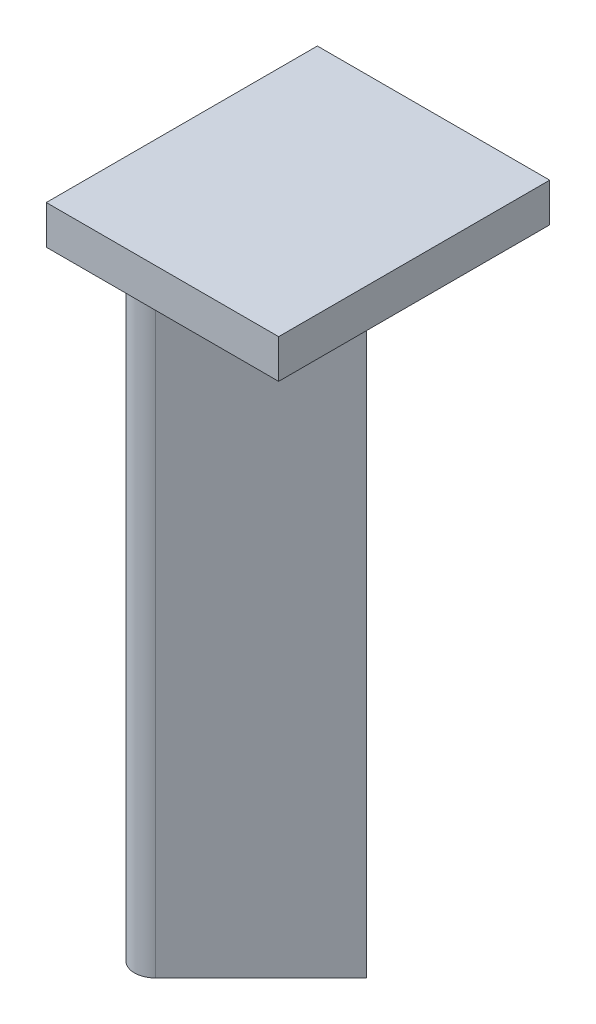
ISO-10303-21;
HEADER;
FILE_DESCRIPTION(('STEP AP214'),'2;1');
FILE_NAME('part.step','',(''),(''),'','','');
FILE_SCHEMA(('AUTOMOTIVE_DESIGN { 1 0 10303 214 1 1 1 1 }'));
ENDSEC;
DATA;
#1=APPLICATION_CONTEXT('core data for automotive mechanical design processes');
#2=APPLICATION_PROTOCOL_DEFINITION('international standard','automotive_design',2000,#1);
#3=PRODUCT_CONTEXT('',#1,'mechanical');
#4=PRODUCT('Part','Part','',(#3));
#5=PRODUCT_RELATED_PRODUCT_CATEGORY('part','',(#4));
#6=PRODUCT_DEFINITION_FORMATION('','',#4);
#7=PRODUCT_DEFINITION_CONTEXT('part definition',#1,'design');
#8=PRODUCT_DEFINITION('design','',#6,#7);
#9=PRODUCT_DEFINITION_SHAPE('','',#8);
#10=(LENGTH_UNIT() NAMED_UNIT(*) SI_UNIT(.MILLI.,.METRE.));
#11=(NAMED_UNIT(*) PLANE_ANGLE_UNIT() SI_UNIT($,.RADIAN.));
#12=(NAMED_UNIT(*) SI_UNIT($,.STERADIAN.) SOLID_ANGLE_UNIT());
#13=UNCERTAINTY_MEASURE_WITH_UNIT(LENGTH_MEASURE(1.E-05),#10,'distance_accuracy_value','');
#14=(GEOMETRIC_REPRESENTATION_CONTEXT(3) GLOBAL_UNCERTAINTY_ASSIGNED_CONTEXT((#13)) GLOBAL_UNIT_ASSIGNED_CONTEXT((#10,
#11,#12)) REPRESENTATION_CONTEXT('',''));
#15=CARTESIAN_POINT('',(0.,0.,0.));
#16=DIRECTION('',(0.,0.,1.));
#17=DIRECTION('',(1.,0.,0.));
#18=AXIS2_PLACEMENT_3D('',#15,#16,#17);
#19=CARTESIAN_POINT('',(0.,78.,0.));
#20=DIRECTION('',(0.,-1.,0.));
#21=DIRECTION('',(0.,0.,-1.));
#22=AXIS2_PLACEMENT_3D('',#19,#20,#21);
#23=CYLINDRICAL_SURFACE('',#22,1.02);
#24=CARTESIAN_POINT('',(0.,0.,0.));
#25=DIRECTION('',(0.,-1.,0.));
#26=DIRECTION('',(0.,0.,1.));
#27=AXIS2_PLACEMENT_3D('',#24,#25,#26);
#28=CIRCLE('',#27,1.02);
#29=CARTESIAN_POINT('',(-0.706968119469067,0.,-0.735252390716529));
#30=VERTEX_POINT('',#29);
#31=CARTESIAN_POINT('',(-0.706968119469067,0.,0.735252390716529));
#32=VERTEX_POINT('',#31);
#33=EDGE_CURVE('E135',#30,#32,#28,.T.);
#34=ORIENTED_EDGE('',*,*,#33,.T.);
#35=DIRECTION('',(0.,-1.,0.));
#36=VECTOR('',#35,1.);
#37=CARTESIAN_POINT('',(-0.706968119469067,78.,0.735252390716529));
#38=LINE('',#37,#36);
#39=CARTESIAN_POINT('',(-0.706968119469067,78.,0.735252390716529));
#40=VERTEX_POINT('',#39);
#41=EDGE_CURVE('E11',#40,#32,#38,.T.);
#42=ORIENTED_EDGE('',*,*,#41,.F.);
#43=CARTESIAN_POINT('',(0.,78.,0.));
#44=DIRECTION('',(0.,-1.,0.));
#45=DIRECTION('',(0.,0.,1.));
#46=AXIS2_PLACEMENT_3D('',#43,#44,#45);
#47=CIRCLE('',#46,1.02);
#48=CARTESIAN_POINT('',(-0.706968119469067,78.,-0.735252390716529));
#49=VERTEX_POINT('',#48);
#50=EDGE_CURVE('E148',#49,#40,#47,.T.);
#51=ORIENTED_EDGE('',*,*,#50,.F.);
#52=DIRECTION('',(0.,-1.,0.));
#53=VECTOR('',#52,1.);
#54=CARTESIAN_POINT('',(-0.706968119469067,78.,-0.735252390716529));
#55=LINE('',#54,#53);
#56=EDGE_CURVE('E134',#49,#30,#55,.T.);
#57=ORIENTED_EDGE('',*,*,#56,.T.);
#58=EDGE_LOOP('',(#34,#42,#51,#57));
#59=FACE_BOUND('',#58,.T.);
#60=ADVANCED_FACE('F34',(#59),#23,.F.);
#61=CARTESIAN_POINT('',(-0.706968119469067,78.,0.735252390716529));
#62=DIRECTION('',(0.707106781186548,0.,0.707106781186547));
#63=DIRECTION('',(0.707106781186547,0.,-0.707106781186548));
#64=AXIS2_PLACEMENT_3D('',#61,#62,#63);
#65=PLANE('',#64);
#66=DIRECTION('',(-0.707106781186547,0.,0.707106781186548));
#67=VECTOR('',#66,1.);
#68=CARTESIAN_POINT('',(-0.706968119469067,0.,0.735252390716529));
#69=LINE('',#68,#67);
#70=CARTESIAN_POINT('',(-9.81464212286927,0.,9.84292639411675));
#71=VERTEX_POINT('',#70);
#72=EDGE_CURVE('E138',#32,#71,#69,.T.);
#73=ORIENTED_EDGE('',*,*,#72,.T.);
#74=DIRECTION('',(0.,-1.,0.));
#75=VECTOR('',#74,1.);
#76=CARTESIAN_POINT('',(-9.81464212286927,78.,9.84292639411675));
#77=LINE('',#76,#75);
#78=CARTESIAN_POINT('',(-9.81464212286927,78.,9.84292639411675));
#79=VERTEX_POINT('',#78);
#80=EDGE_CURVE('E42',#79,#71,#77,.T.);
#81=ORIENTED_EDGE('',*,*,#80,.F.);
#82=DIRECTION('',(-0.707106781186547,0.,0.707106781186548));
#83=VECTOR('',#82,1.);
#84=CARTESIAN_POINT('',(-0.706968119469067,78.,0.735252390716529));
#85=LINE('',#84,#83);
#86=EDGE_CURVE('E89',#40,#79,#85,.T.);
#87=ORIENTED_EDGE('',*,*,#86,.F.);
#88=ORIENTED_EDGE('',*,*,#41,.T.);
#89=EDGE_LOOP('',(#73,#81,#87,#88));
#90=FACE_BOUND('',#89,.T.);
#91=ADVANCED_FACE('F240',(#90),#65,.F.);
#92=CARTESIAN_POINT('',(-7.91959594928933,78.,11.7379725676967));
#93=DIRECTION('',(0.,-1.,0.));
#94=DIRECTION('',(0.,0.,-1.));
#95=AXIS2_PLACEMENT_3D('',#92,#93,#94);
#96=CYLINDRICAL_SURFACE('',#95,2.68);
#97=CARTESIAN_POINT('',(-7.91959594928933,0.,11.7379725676967));
#98=DIRECTION('',(0.,1.,0.));
#99=DIRECTION('',(0.,0.,-1.));
#100=AXIS2_PLACEMENT_3D('',#97,#98,#99);
#101=CIRCLE('',#100,2.68);
#102=CARTESIAN_POINT('',(-6.02454977570939,0.,13.6330187412766));
#103=VERTEX_POINT('',#102);
#104=EDGE_CURVE('E141',#71,#103,#101,.T.);
#105=ORIENTED_EDGE('',*,*,#104,.T.);
#106=DIRECTION('',(0.,-1.,0.));
#107=VECTOR('',#106,1.);
#108=CARTESIAN_POINT('',(-6.02454977570939,78.,13.6330187412766));
#109=LINE('',#108,#107);
#110=CARTESIAN_POINT('',(-6.02454977570939,78.,13.6330187412766));
#111=VERTEX_POINT('',#110);
#112=EDGE_CURVE('E112',#111,#103,#109,.T.);
#113=ORIENTED_EDGE('',*,*,#112,.F.);
#114=CARTESIAN_POINT('',(-7.91959594928933,78.,11.7379725676967));
#115=DIRECTION('',(0.,1.,0.));
#116=DIRECTION('',(0.,0.,-1.));
#117=AXIS2_PLACEMENT_3D('',#114,#115,#116);
#118=CIRCLE('',#117,2.68);
#119=EDGE_CURVE('E126',#79,#111,#118,.T.);
#120=ORIENTED_EDGE('',*,*,#119,.F.);
#121=ORIENTED_EDGE('',*,*,#80,.T.);
#122=EDGE_LOOP('',(#105,#113,#120,#121));
#123=FACE_BOUND('',#122,.T.);
#124=ADVANCED_FACE('F155',(#123),#96,.T.);
#125=CARTESIAN_POINT('',(7.60846896556725,78.,0.));
#126=DIRECTION('',(-0.707106781186548,0.,-0.707106781186548));
#127=DIRECTION('',(-0.707106781186548,0.,0.707106781186548));
#128=AXIS2_PLACEMENT_3D('',#125,#126,#127);
#129=PLANE('',#128);
#130=DIRECTION('',(0.707106781186548,0.,-0.707106781186548));
#131=VECTOR('',#130,1.);
#132=CARTESIAN_POINT('',(7.60846896556725,0.,0.));
#133=LINE('',#132,#131);
#134=CARTESIAN_POINT('',(7.60846896556725,0.,0.));
#135=VERTEX_POINT('',#134);
#136=EDGE_CURVE('E109',#103,#135,#133,.T.);
#137=ORIENTED_EDGE('',*,*,#136,.T.);
#138=DIRECTION('',(0.,-1.,0.));
#139=VECTOR('',#138,1.);
#140=CARTESIAN_POINT('',(7.60846896556725,78.,0.));
#141=LINE('',#140,#139);
#142=CARTESIAN_POINT('',(7.60846896556725,78.,0.));
#143=VERTEX_POINT('',#142);
#144=EDGE_CURVE('E101',#143,#135,#141,.T.);
#145=ORIENTED_EDGE('',*,*,#144,.F.);
#146=DIRECTION('',(0.707106781186548,0.,-0.707106781186548));
#147=VECTOR('',#146,1.);
#148=CARTESIAN_POINT('',(7.60846896556725,78.,0.));
#149=LINE('',#148,#147);
#150=EDGE_CURVE('E106',#111,#143,#149,.T.);
#151=ORIENTED_EDGE('',*,*,#150,.F.);
#152=ORIENTED_EDGE('',*,*,#112,.T.);
#153=EDGE_LOOP('',(#137,#145,#151,#152));
#154=FACE_BOUND('',#153,.T.);
#155=ADVANCED_FACE('F103',(#154),#129,.F.);
#156=CARTESIAN_POINT('',(7.60846896556725,78.,0.));
#157=DIRECTION('',(-0.707106781186548,0.,0.707106781186547));
#158=DIRECTION('',(0.707106781186547,0.,0.707106781186548));
#159=AXIS2_PLACEMENT_3D('',#156,#157,#158);
#160=PLANE('',#159);
#161=DIRECTION('',(-0.707106781186547,0.,-0.707106781186548));
#162=VECTOR('',#161,1.);
#163=CARTESIAN_POINT('',(7.60846896556725,0.,0.));
#164=LINE('',#163,#162);
#165=CARTESIAN_POINT('',(-6.02454977570938,0.,-13.6330187412766));
#166=VERTEX_POINT('',#165);
#167=EDGE_CURVE('E144',#135,#166,#164,.T.);
#168=ORIENTED_EDGE('',*,*,#167,.T.);
#169=DIRECTION('',(0.,-1.,0.));
#170=VECTOR('',#169,1.);
#171=CARTESIAN_POINT('',(-6.02454977570938,78.,-13.6330187412766));
#172=LINE('',#171,#170);
#173=CARTESIAN_POINT('',(-6.02454977570938,78.,-13.6330187412766));
#174=VERTEX_POINT('',#173);
#175=EDGE_CURVE('E113',#174,#166,#172,.T.);
#176=ORIENTED_EDGE('',*,*,#175,.F.);
#177=DIRECTION('',(-0.707106781186547,0.,-0.707106781186548));
#178=VECTOR('',#177,1.);
#179=CARTESIAN_POINT('',(7.60846896556725,78.,0.));
#180=LINE('',#179,#178);
#181=EDGE_CURVE('E116',#143,#174,#180,.T.);
#182=ORIENTED_EDGE('',*,*,#181,.F.);
#183=ORIENTED_EDGE('',*,*,#144,.T.);
#184=EDGE_LOOP('',(#168,#176,#182,#183));
#185=FACE_BOUND('',#184,.T.);
#186=ADVANCED_FACE('F117',(#185),#160,.F.);
#187=CARTESIAN_POINT('',(-7.91959594928933,78.,-11.7379725676967));
#188=DIRECTION('',(0.,-1.,0.));
#189=DIRECTION('',(0.,0.,-1.));
#190=AXIS2_PLACEMENT_3D('',#187,#188,#189);
#191=CYLINDRICAL_SURFACE('',#190,2.68);
#192=CARTESIAN_POINT('',(-7.91959594928933,0.,-11.7379725676967));
#193=DIRECTION('',(0.,1.,0.));
#194=DIRECTION('',(0.,0.,-1.));
#195=AXIS2_PLACEMENT_3D('',#192,#193,#194);
#196=CIRCLE('',#195,2.68);
#197=CARTESIAN_POINT('',(-9.81464212286928,0.,-9.84292639411674));
#198=VERTEX_POINT('',#197);
#199=EDGE_CURVE('E75',#166,#198,#196,.T.);
#200=ORIENTED_EDGE('',*,*,#199,.T.);
#201=DIRECTION('',(0.,-1.,0.));
#202=VECTOR('',#201,1.);
#203=CARTESIAN_POINT('',(-9.81464212286928,78.,-9.84292639411674));
#204=LINE('',#203,#202);
#205=CARTESIAN_POINT('',(-9.81464212286928,78.,-9.84292639411674));
#206=VERTEX_POINT('',#205);
#207=EDGE_CURVE('E50',#206,#198,#204,.T.);
#208=ORIENTED_EDGE('',*,*,#207,.F.);
#209=CARTESIAN_POINT('',(-7.91959594928933,78.,-11.7379725676967));
#210=DIRECTION('',(0.,1.,0.));
#211=DIRECTION('',(0.,0.,-1.));
#212=AXIS2_PLACEMENT_3D('',#209,#210,#211);
#213=CIRCLE('',#212,2.68);
#214=EDGE_CURVE('E120',#174,#206,#213,.T.);
#215=ORIENTED_EDGE('',*,*,#214,.F.);
#216=ORIENTED_EDGE('',*,*,#175,.T.);
#217=EDGE_LOOP('',(#200,#208,#215,#216));
#218=FACE_BOUND('',#217,.T.);
#219=ADVANCED_FACE('F159',(#218),#191,.T.);
#220=CARTESIAN_POINT('',(-0.706968119469067,78.,-0.735252390716529));
#221=DIRECTION('',(0.707106781186548,0.,-0.707106781186548));
#222=DIRECTION('',(-0.707106781186548,0.,-0.707106781186548));
#223=AXIS2_PLACEMENT_3D('',#220,#221,#222);
#224=PLANE('',#223);
#225=DIRECTION('',(0.707106781186548,0.,0.707106781186548));
#226=VECTOR('',#225,1.);
#227=CARTESIAN_POINT('',(-0.706968119469067,0.,-0.735252390716529));
#228=LINE('',#227,#226);
#229=EDGE_CURVE('E81',#198,#30,#228,.T.);
#230=ORIENTED_EDGE('',*,*,#229,.T.);
#231=ORIENTED_EDGE('',*,*,#56,.F.);
#232=DIRECTION('',(0.707106781186548,0.,0.707106781186548));
#233=VECTOR('',#232,1.);
#234=CARTESIAN_POINT('',(-0.706968119469067,78.,-0.735252390716529));
#235=LINE('',#234,#233);
#236=EDGE_CURVE('E132',#206,#49,#235,.T.);
#237=ORIENTED_EDGE('',*,*,#236,.F.);
#238=ORIENTED_EDGE('',*,*,#207,.T.);
#239=EDGE_LOOP('',(#230,#231,#237,#238));
#240=FACE_BOUND('',#239,.T.);
#241=ADVANCED_FACE('F163',(#240),#224,.F.);
#242=CARTESIAN_POINT('',(0.,0.,0.));
#243=DIRECTION('',(0.,1.,0.));
#244=DIRECTION('',(0.,0.,1.));
#245=AXIS2_PLACEMENT_3D('',#242,#243,#244);
#246=PLANE('',#245);
#247=ORIENTED_EDGE('',*,*,#33,.F.);
#248=ORIENTED_EDGE('',*,*,#229,.F.);
#249=ORIENTED_EDGE('',*,*,#199,.F.);
#250=ORIENTED_EDGE('',*,*,#167,.F.);
#251=ORIENTED_EDGE('',*,*,#136,.F.);
#252=ORIENTED_EDGE('',*,*,#104,.F.);
#253=ORIENTED_EDGE('',*,*,#72,.F.);
#254=EDGE_LOOP('',(#247,#248,#249,#250,#251,#252,#253));
#255=FACE_BOUND('',#254,.T.);
#256=ADVANCED_FACE('F158',(#255),#246,.F.);
#257=CARTESIAN_POINT('',(-16.777418097292,83.,16.955589692925));
#258=DIRECTION('',(1.,0.,0.));
#259=DIRECTION('',(0.,0.,-1.));
#260=AXIS2_PLACEMENT_3D('',#257,#258,#259);
#261=PLANE('',#260);
#262=DIRECTION('',(0.,0.,1.));
#263=VECTOR('',#262,1.);
#264=CARTESIAN_POINT('',(-16.777418097292,78.,16.955589692925));
#265=LINE('',#264,#263);
#266=CARTESIAN_POINT('',(-16.777418097292,78.,-18.044410307075));
#267=VERTEX_POINT('',#266);
#268=CARTESIAN_POINT('',(-16.777418097292,78.,16.955589692925));
#269=VERTEX_POINT('',#268);
#270=EDGE_CURVE('E189',#267,#269,#265,.T.);
#271=ORIENTED_EDGE('',*,*,#270,.T.);
#272=DIRECTION('',(0.,-1.,0.));
#273=VECTOR('',#272,1.);
#274=CARTESIAN_POINT('',(-16.777418097292,83.,16.955589692925));
#275=LINE('',#274,#273);
#276=CARTESIAN_POINT('',(-16.777418097292,83.,16.955589692925));
#277=VERTEX_POINT('',#276);
#278=EDGE_CURVE('E139',#277,#269,#275,.T.);
#279=ORIENTED_EDGE('',*,*,#278,.F.);
#280=DIRECTION('',(0.,0.,1.));
#281=VECTOR('',#280,1.);
#282=CARTESIAN_POINT('',(-16.777418097292,83.,16.955589692925));
#283=LINE('',#282,#281);
#284=CARTESIAN_POINT('',(-16.777418097292,83.,-18.044410307075));
#285=VERTEX_POINT('',#284);
#286=EDGE_CURVE('E182',#285,#277,#283,.T.);
#287=ORIENTED_EDGE('',*,*,#286,.F.);
#288=DIRECTION('',(0.,-1.,0.));
#289=VECTOR('',#288,1.);
#290=CARTESIAN_POINT('',(-16.777418097292,83.,-18.044410307075));
#291=LINE('',#290,#289);
#292=EDGE_CURVE('E175',#285,#267,#291,.T.);
#293=ORIENTED_EDGE('',*,*,#292,.T.);
#294=EDGE_LOOP('',(#271,#279,#287,#293));
#295=FACE_BOUND('',#294,.T.);
#296=ADVANCED_FACE('F214',(#295),#261,.F.);
#297=CARTESIAN_POINT('',(-16.777418097292,83.,16.955589692925));
#298=DIRECTION('',(0.,0.,-1.));
#299=DIRECTION('',(-1.,0.,0.));
#300=AXIS2_PLACEMENT_3D('',#297,#298,#299);
#301=PLANE('',#300);
#302=DIRECTION('',(1.,0.,0.));
#303=VECTOR('',#302,1.);
#304=CARTESIAN_POINT('',(-16.777418097292,78.,16.955589692925));
#305=LINE('',#304,#303);
#306=CARTESIAN_POINT('',(13.222581902708,78.,16.955589692925));
#307=VERTEX_POINT('',#306);
#308=EDGE_CURVE('E186',#269,#307,#305,.T.);
#309=ORIENTED_EDGE('',*,*,#308,.T.);
#310=DIRECTION('',(0.,-1.,0.));
#311=VECTOR('',#310,1.);
#312=CARTESIAN_POINT('',(13.222581902708,83.,16.955589692925));
#313=LINE('',#312,#311);
#314=CARTESIAN_POINT('',(13.222581902708,83.,16.955589692925));
#315=VERTEX_POINT('',#314);
#316=EDGE_CURVE('E169',#315,#307,#313,.T.);
#317=ORIENTED_EDGE('',*,*,#316,.F.);
#318=DIRECTION('',(1.,0.,0.));
#319=VECTOR('',#318,1.);
#320=CARTESIAN_POINT('',(-16.777418097292,83.,16.955589692925));
#321=LINE('',#320,#319);
#322=EDGE_CURVE('E197',#277,#315,#321,.T.);
#323=ORIENTED_EDGE('',*,*,#322,.F.);
#324=ORIENTED_EDGE('',*,*,#278,.T.);
#325=EDGE_LOOP('',(#309,#317,#323,#324));
#326=FACE_BOUND('',#325,.T.);
#327=ADVANCED_FACE('F218',(#326),#301,.F.);
#328=CARTESIAN_POINT('',(13.222581902708,83.,16.955589692925));
#329=DIRECTION('',(-1.,0.,0.));
#330=DIRECTION('',(0.,0.,1.));
#331=AXIS2_PLACEMENT_3D('',#328,#329,#330);
#332=PLANE('',#331);
#333=DIRECTION('',(0.,0.,-1.));
#334=VECTOR('',#333,1.);
#335=CARTESIAN_POINT('',(13.222581902708,78.,16.955589692925));
#336=LINE('',#335,#334);
#337=CARTESIAN_POINT('',(13.222581902708,78.,-18.044410307075));
#338=VERTEX_POINT('',#337);
#339=EDGE_CURVE('E183',#307,#338,#336,.T.);
#340=ORIENTED_EDGE('',*,*,#339,.T.);
#341=DIRECTION('',(0.,-1.,0.));
#342=VECTOR('',#341,1.);
#343=CARTESIAN_POINT('',(13.222581902708,83.,-18.044410307075));
#344=LINE('',#343,#342);
#345=CARTESIAN_POINT('',(13.222581902708,83.,-18.044410307075));
#346=VERTEX_POINT('',#345);
#347=EDGE_CURVE('E172',#346,#338,#344,.T.);
#348=ORIENTED_EDGE('',*,*,#347,.F.);
#349=DIRECTION('',(0.,0.,-1.));
#350=VECTOR('',#349,1.);
#351=CARTESIAN_POINT('',(13.222581902708,83.,16.955589692925));
#352=LINE('',#351,#350);
#353=EDGE_CURVE('E194',#315,#346,#352,.T.);
#354=ORIENTED_EDGE('',*,*,#353,.F.);
#355=ORIENTED_EDGE('',*,*,#316,.T.);
#356=EDGE_LOOP('',(#340,#348,#354,#355));
#357=FACE_BOUND('',#356,.T.);
#358=ADVANCED_FACE('F263',(#357),#332,.F.);
#359=CARTESIAN_POINT('',(-16.777418097292,83.,-18.044410307075));
#360=DIRECTION('',(0.,0.,1.));
#361=DIRECTION('',(1.,0.,0.));
#362=AXIS2_PLACEMENT_3D('',#359,#360,#361);
#363=PLANE('',#362);
#364=DIRECTION('',(-1.,0.,0.));
#365=VECTOR('',#364,1.);
#366=CARTESIAN_POINT('',(-16.777418097292,78.,-18.044410307075));
#367=LINE('',#366,#365);
#368=EDGE_CURVE('E179',#338,#267,#367,.T.);
#369=ORIENTED_EDGE('',*,*,#368,.T.);
#370=ORIENTED_EDGE('',*,*,#292,.F.);
#371=DIRECTION('',(-1.,0.,0.));
#372=VECTOR('',#371,1.);
#373=CARTESIAN_POINT('',(-16.777418097292,83.,-18.044410307075));
#374=LINE('',#373,#372);
#375=EDGE_CURVE('E178',#346,#285,#374,.T.);
#376=ORIENTED_EDGE('',*,*,#375,.F.);
#377=ORIENTED_EDGE('',*,*,#347,.T.);
#378=EDGE_LOOP('',(#369,#370,#376,#377));
#379=FACE_BOUND('',#378,.T.);
#380=ADVANCED_FACE('F230',(#379),#363,.F.);
#381=CARTESIAN_POINT('',(0.,83.,0.));
#382=DIRECTION('',(0.,-1.,0.));
#383=DIRECTION('',(0.,0.,-1.));
#384=AXIS2_PLACEMENT_3D('',#381,#382,#383);
#385=PLANE('',#384);
#386=ORIENTED_EDGE('',*,*,#286,.T.);
#387=ORIENTED_EDGE('',*,*,#322,.T.);
#388=ORIENTED_EDGE('',*,*,#353,.T.);
#389=ORIENTED_EDGE('',*,*,#375,.T.);
#390=EDGE_LOOP('',(#386,#387,#388,#389));
#391=FACE_BOUND('',#390,.T.);
#392=ADVANCED_FACE('F205',(#391),#385,.F.);
#393=CARTESIAN_POINT('',(0.,78.,0.));
#394=DIRECTION('',(0.,-1.,0.));
#395=DIRECTION('',(0.,0.,-1.));
#396=AXIS2_PLACEMENT_3D('',#393,#394,#395);
#397=PLANE('',#396);
#398=ORIENTED_EDGE('',*,*,#236,.T.);
#399=ORIENTED_EDGE('',*,*,#50,.T.);
#400=ORIENTED_EDGE('',*,*,#86,.T.);
#401=ORIENTED_EDGE('',*,*,#119,.T.);
#402=ORIENTED_EDGE('',*,*,#150,.T.);
#403=ORIENTED_EDGE('',*,*,#181,.T.);
#404=ORIENTED_EDGE('',*,*,#214,.T.);
#405=EDGE_LOOP('',(#398,#399,#400,#401,#402,#403,#404));
#406=FACE_BOUND('',#405,.T.);
#407=ORIENTED_EDGE('',*,*,#270,.F.);
#408=ORIENTED_EDGE('',*,*,#368,.F.);
#409=ORIENTED_EDGE('',*,*,#339,.F.);
#410=ORIENTED_EDGE('',*,*,#308,.F.);
#411=EDGE_LOOP('',(#407,#408,#409,#410));
#412=FACE_BOUND('',#411,.T.);
#413=ADVANCED_FACE('F123',(#406,#412),#397,.T.);
#414=CLOSED_SHELL('',(#60,#91,#124,#155,#186,#219,#241,#256,#296,#327,#358,#380,#392,#413));
#415=MANIFOLD_SOLID_BREP('B2',#414);
#416=ADVANCED_BREP_SHAPE_REPRESENTATION('',(#18,#415),#14);
#417=SHAPE_DEFINITION_REPRESENTATION(#9,#416);
ENDSEC;
END-ISO-10303-21;
